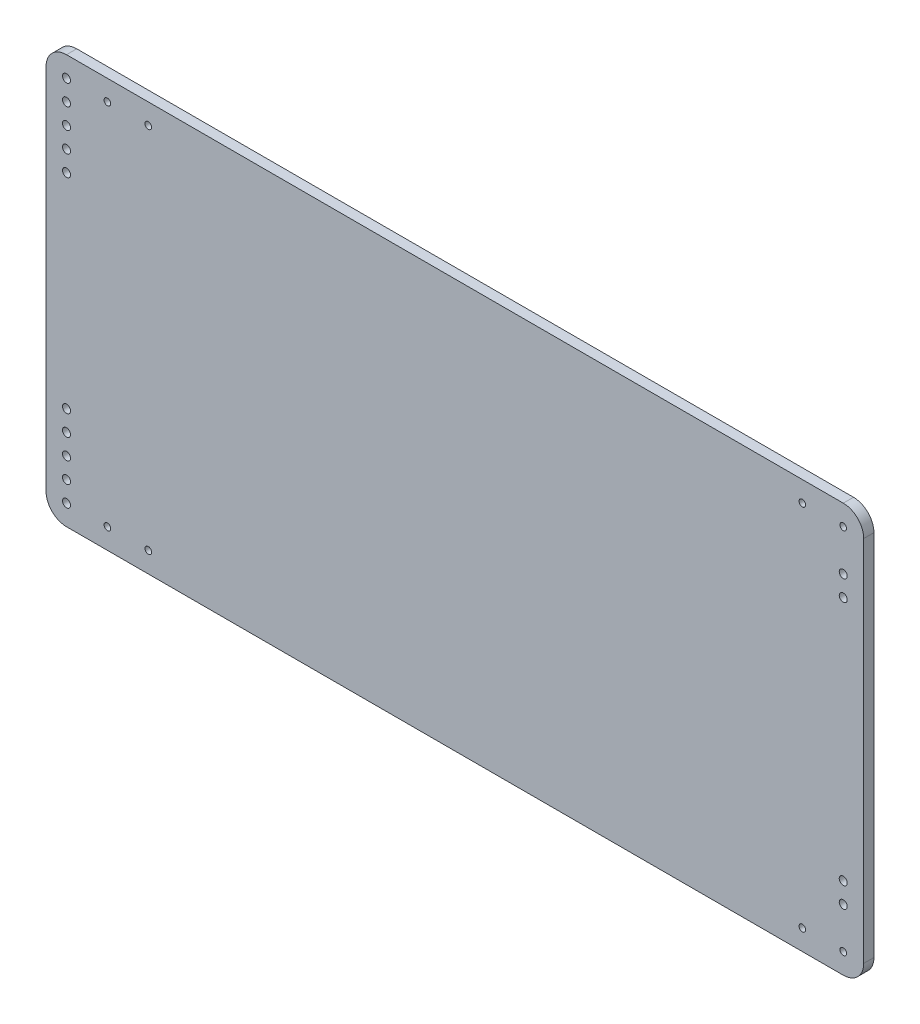
ISO-10303-21;
HEADER;
FILE_DESCRIPTION(('STEP AP214'),'2;1');
FILE_NAME('part.step','',(''),(''),'','','');
FILE_SCHEMA(('AUTOMOTIVE_DESIGN { 1 0 10303 214 1 1 1 1 }'));
ENDSEC;
DATA;
#1=APPLICATION_CONTEXT('core data for automotive mechanical design processes');
#2=APPLICATION_PROTOCOL_DEFINITION('international standard','automotive_design',2000,#1);
#3=PRODUCT_CONTEXT('',#1,'mechanical');
#4=PRODUCT('Part','Part','',(#3));
#5=PRODUCT_RELATED_PRODUCT_CATEGORY('part','',(#4));
#6=PRODUCT_DEFINITION_FORMATION('','',#4);
#7=PRODUCT_DEFINITION_CONTEXT('part definition',#1,'design');
#8=PRODUCT_DEFINITION('design','',#6,#7);
#9=PRODUCT_DEFINITION_SHAPE('','',#8);
#10=(LENGTH_UNIT() NAMED_UNIT(*) SI_UNIT(.MILLI.,.METRE.));
#11=(NAMED_UNIT(*) PLANE_ANGLE_UNIT() SI_UNIT($,.RADIAN.));
#12=(NAMED_UNIT(*) SI_UNIT($,.STERADIAN.) SOLID_ANGLE_UNIT());
#13=UNCERTAINTY_MEASURE_WITH_UNIT(LENGTH_MEASURE(1.E-05),#10,'distance_accuracy_value','');
#14=(GEOMETRIC_REPRESENTATION_CONTEXT(3) GLOBAL_UNCERTAINTY_ASSIGNED_CONTEXT((#13)) GLOBAL_UNIT_ASSIGNED_CONTEXT((#10,
#11,#12)) REPRESENTATION_CONTEXT('',''));
#15=CARTESIAN_POINT('',(0.,0.,0.));
#16=DIRECTION('',(0.,0.,1.));
#17=DIRECTION('',(1.,0.,0.));
#18=AXIS2_PLACEMENT_3D('',#15,#16,#17);
#19=CARTESIAN_POINT('',(495.3,241.3,6.35));
#20=DIRECTION('',(0.,0.,-1.));
#21=DIRECTION('',(-1.,0.,0.));
#22=AXIS2_PLACEMENT_3D('',#19,#20,#21);
#23=CYLINDRICAL_SURFACE('',#22,12.7);
#24=CARTESIAN_POINT('',(495.3,241.3,0.));
#25=DIRECTION('',(0.,0.,1.));
#26=DIRECTION('',(-1.,0.,0.));
#27=AXIS2_PLACEMENT_3D('',#24,#25,#26);
#28=CIRCLE('',#27,12.7);
#29=CARTESIAN_POINT('',(508.,241.3,0.));
#30=VERTEX_POINT('',#29);
#31=CARTESIAN_POINT('',(495.3,254.,0.));
#32=VERTEX_POINT('',#31);
#33=EDGE_CURVE('E139',#30,#32,#28,.T.);
#34=ORIENTED_EDGE('',*,*,#33,.T.);
#35=DIRECTION('',(0.,0.,-1.));
#36=VECTOR('',#35,1.);
#37=CARTESIAN_POINT('',(495.3,254.,6.35));
#38=LINE('',#37,#36);
#39=CARTESIAN_POINT('',(495.3,254.,6.35));
#40=VERTEX_POINT('',#39);
#41=EDGE_CURVE('E11',#40,#32,#38,.T.);
#42=ORIENTED_EDGE('',*,*,#41,.F.);
#43=CARTESIAN_POINT('',(495.3,241.3,6.35));
#44=DIRECTION('',(0.,0.,1.));
#45=DIRECTION('',(-1.,0.,0.));
#46=AXIS2_PLACEMENT_3D('',#43,#44,#45);
#47=CIRCLE('',#46,12.7);
#48=CARTESIAN_POINT('',(508.,241.3,6.35));
#49=VERTEX_POINT('',#48);
#50=EDGE_CURVE('E162',#49,#40,#47,.T.);
#51=ORIENTED_EDGE('',*,*,#50,.F.);
#52=DIRECTION('',(0.,0.,-1.));
#53=VECTOR('',#52,1.);
#54=CARTESIAN_POINT('',(508.,241.3,6.35));
#55=LINE('',#54,#53);
#56=EDGE_CURVE('E135',#49,#30,#55,.T.);
#57=ORIENTED_EDGE('',*,*,#56,.T.);
#58=EDGE_LOOP('',(#34,#42,#51,#57));
#59=FACE_BOUND('',#58,.T.);
#60=ADVANCED_FACE('F38',(#59),#23,.T.);
#61=CARTESIAN_POINT('',(12.7000000000001,254.,6.35));
#62=DIRECTION('',(0.,-1.,0.));
#63=DIRECTION('',(0.,0.,-1.));
#64=AXIS2_PLACEMENT_3D('',#61,#62,#63);
#65=PLANE('',#64);
#66=DIRECTION('',(-1.,0.,0.));
#67=VECTOR('',#66,1.);
#68=CARTESIAN_POINT('',(12.7000000000001,254.,0.));
#69=LINE('',#68,#67);
#70=CARTESIAN_POINT('',(12.7000000000001,254.,0.));
#71=VERTEX_POINT('',#70);
#72=EDGE_CURVE('E143',#32,#71,#69,.T.);
#73=ORIENTED_EDGE('',*,*,#72,.T.);
#74=DIRECTION('',(0.,0.,-1.));
#75=VECTOR('',#74,1.);
#76=CARTESIAN_POINT('',(12.7000000000001,254.,6.35));
#77=LINE('',#76,#75);
#78=CARTESIAN_POINT('',(12.7000000000001,254.,6.35));
#79=VERTEX_POINT('',#78);
#80=EDGE_CURVE('E47',#79,#71,#77,.T.);
#81=ORIENTED_EDGE('',*,*,#80,.F.);
#82=DIRECTION('',(-1.,0.,0.));
#83=VECTOR('',#82,1.);
#84=CARTESIAN_POINT('',(12.7000000000001,254.,6.35));
#85=LINE('',#84,#83);
#86=EDGE_CURVE('E98',#40,#79,#85,.T.);
#87=ORIENTED_EDGE('',*,*,#86,.F.);
#88=ORIENTED_EDGE('',*,*,#41,.T.);
#89=EDGE_LOOP('',(#73,#81,#87,#88));
#90=FACE_BOUND('',#89,.T.);
#91=ADVANCED_FACE('F449',(#90),#65,.F.);
#92=CARTESIAN_POINT('',(12.7,241.3,6.35));
#93=DIRECTION('',(0.,0.,-1.));
#94=DIRECTION('',(-1.,0.,0.));
#95=AXIS2_PLACEMENT_3D('',#92,#93,#94);
#96=CYLINDRICAL_SURFACE('',#95,12.7);
#97=CARTESIAN_POINT('',(12.7,241.3,0.));
#98=DIRECTION('',(0.,0.,1.));
#99=DIRECTION('',(-1.,0.,0.));
#100=AXIS2_PLACEMENT_3D('',#97,#98,#99);
#101=CIRCLE('',#100,12.7);
#102=CARTESIAN_POINT('',(0.,241.3,0.));
#103=VERTEX_POINT('',#102);
#104=EDGE_CURVE('E147',#71,#103,#101,.T.);
#105=ORIENTED_EDGE('',*,*,#104,.T.);
#106=DIRECTION('',(0.,0.,-1.));
#107=VECTOR('',#106,1.);
#108=CARTESIAN_POINT('',(0.,241.3,6.35));
#109=LINE('',#108,#107);
#110=CARTESIAN_POINT('',(0.,241.3,6.35));
#111=VERTEX_POINT('',#110);
#112=EDGE_CURVE('E173',#111,#103,#109,.T.);
#113=ORIENTED_EDGE('',*,*,#112,.F.);
#114=CARTESIAN_POINT('',(12.7,241.3,6.35));
#115=DIRECTION('',(0.,0.,1.));
#116=DIRECTION('',(-1.,0.,0.));
#117=AXIS2_PLACEMENT_3D('',#114,#115,#116);
#118=CIRCLE('',#117,12.7);
#119=EDGE_CURVE('E183',#79,#111,#118,.T.);
#120=ORIENTED_EDGE('',*,*,#119,.F.);
#121=ORIENTED_EDGE('',*,*,#80,.T.);
#122=EDGE_LOOP('',(#105,#113,#120,#121));
#123=FACE_BOUND('',#122,.T.);
#124=ADVANCED_FACE('F181',(#123),#96,.T.);
#125=CARTESIAN_POINT('',(0.,12.7000000000001,6.35));
#126=DIRECTION('',(1.,0.,0.));
#127=DIRECTION('',(0.,0.,-1.));
#128=AXIS2_PLACEMENT_3D('',#125,#126,#127);
#129=PLANE('',#128);
#130=DIRECTION('',(0.,-1.,0.));
#131=VECTOR('',#130,1.);
#132=CARTESIAN_POINT('',(0.,12.7000000000001,0.));
#133=LINE('',#132,#131);
#134=CARTESIAN_POINT('',(0.,12.7000000000001,0.));
#135=VERTEX_POINT('',#134);
#136=EDGE_CURVE('E150',#103,#135,#133,.T.);
#137=ORIENTED_EDGE('',*,*,#136,.T.);
#138=DIRECTION('',(0.,0.,-1.));
#139=VECTOR('',#138,1.);
#140=CARTESIAN_POINT('',(0.,12.7000000000001,6.35));
#141=LINE('',#140,#139);
#142=CARTESIAN_POINT('',(0.,12.7000000000001,6.35));
#143=VERTEX_POINT('',#142);
#144=EDGE_CURVE('E169',#143,#135,#141,.T.);
#145=ORIENTED_EDGE('',*,*,#144,.F.);
#146=DIRECTION('',(0.,-1.,0.));
#147=VECTOR('',#146,1.);
#148=CARTESIAN_POINT('',(0.,12.7000000000001,6.35));
#149=LINE('',#148,#147);
#150=EDGE_CURVE('E196',#111,#143,#149,.T.);
#151=ORIENTED_EDGE('',*,*,#150,.F.);
#152=ORIENTED_EDGE('',*,*,#112,.T.);
#153=EDGE_LOOP('',(#137,#145,#151,#152));
#154=FACE_BOUND('',#153,.T.);
#155=ADVANCED_FACE('F191',(#154),#129,.F.);
#156=CARTESIAN_POINT('',(12.7,12.7,6.35));
#157=DIRECTION('',(0.,0.,-1.));
#158=DIRECTION('',(-1.,0.,0.));
#159=AXIS2_PLACEMENT_3D('',#156,#157,#158);
#160=CYLINDRICAL_SURFACE('',#159,12.7);
#161=CARTESIAN_POINT('',(12.7,12.7,0.));
#162=DIRECTION('',(0.,0.,1.));
#163=DIRECTION('',(-1.,0.,0.));
#164=AXIS2_PLACEMENT_3D('',#161,#162,#163);
#165=CIRCLE('',#164,12.7);
#166=CARTESIAN_POINT('',(12.7000000000001,0.,0.));
#167=VERTEX_POINT('',#166);
#168=EDGE_CURVE('E153',#135,#167,#165,.T.);
#169=ORIENTED_EDGE('',*,*,#168,.T.);
#170=DIRECTION('',(0.,0.,-1.));
#171=VECTOR('',#170,1.);
#172=CARTESIAN_POINT('',(12.7000000000001,0.,6.35));
#173=LINE('',#172,#171);
#174=CARTESIAN_POINT('',(12.7000000000001,0.,6.35));
#175=VERTEX_POINT('',#174);
#176=EDGE_CURVE('E128',#175,#167,#173,.T.);
#177=ORIENTED_EDGE('',*,*,#176,.F.);
#178=CARTESIAN_POINT('',(12.7,12.7,6.35));
#179=DIRECTION('',(0.,0.,1.));
#180=DIRECTION('',(-1.,0.,0.));
#181=AXIS2_PLACEMENT_3D('',#178,#179,#180);
#182=CIRCLE('',#181,12.7);
#183=EDGE_CURVE('E117',#143,#175,#182,.T.);
#184=ORIENTED_EDGE('',*,*,#183,.F.);
#185=ORIENTED_EDGE('',*,*,#144,.T.);
#186=EDGE_LOOP('',(#169,#177,#184,#185));
#187=FACE_BOUND('',#186,.T.);
#188=ADVANCED_FACE('F194',(#187),#160,.T.);
#189=CARTESIAN_POINT('',(12.7000000000001,0.,6.35));
#190=DIRECTION('',(0.,1.,0.));
#191=DIRECTION('',(0.,0.,1.));
#192=AXIS2_PLACEMENT_3D('',#189,#190,#191);
#193=PLANE('',#192);
#194=DIRECTION('',(1.,0.,0.));
#195=VECTOR('',#194,1.);
#196=CARTESIAN_POINT('',(12.7000000000001,0.,0.));
#197=LINE('',#196,#195);
#198=CARTESIAN_POINT('',(495.3,0.,0.));
#199=VERTEX_POINT('',#198);
#200=EDGE_CURVE('E126',#167,#199,#197,.T.);
#201=ORIENTED_EDGE('',*,*,#200,.T.);
#202=DIRECTION('',(0.,0.,-1.));
#203=VECTOR('',#202,1.);
#204=CARTESIAN_POINT('',(495.3,0.,6.35));
#205=LINE('',#204,#203);
#206=CARTESIAN_POINT('',(495.3,0.,6.35));
#207=VERTEX_POINT('',#206);
#208=EDGE_CURVE('E123',#207,#199,#205,.T.);
#209=ORIENTED_EDGE('',*,*,#208,.F.);
#210=DIRECTION('',(1.,0.,0.));
#211=VECTOR('',#210,1.);
#212=CARTESIAN_POINT('',(12.7000000000001,0.,6.35));
#213=LINE('',#212,#211);
#214=EDGE_CURVE('E111',#175,#207,#213,.T.);
#215=ORIENTED_EDGE('',*,*,#214,.F.);
#216=ORIENTED_EDGE('',*,*,#176,.T.);
#217=EDGE_LOOP('',(#201,#209,#215,#216));
#218=FACE_BOUND('',#217,.T.);
#219=ADVANCED_FACE('F124',(#218),#193,.F.);
#220=CARTESIAN_POINT('',(495.3,12.7,6.35));
#221=DIRECTION('',(0.,0.,-1.));
#222=DIRECTION('',(-1.,0.,0.));
#223=AXIS2_PLACEMENT_3D('',#220,#221,#222);
#224=CYLINDRICAL_SURFACE('',#223,12.7);
#225=CARTESIAN_POINT('',(495.3,12.7,0.));
#226=DIRECTION('',(0.,0.,1.));
#227=DIRECTION('',(1.,0.,0.));
#228=AXIS2_PLACEMENT_3D('',#225,#226,#227);
#229=CIRCLE('',#228,12.7);
#230=CARTESIAN_POINT('',(508.,12.7,0.));
#231=VERTEX_POINT('',#230);
#232=EDGE_CURVE('E84',#199,#231,#229,.T.);
#233=ORIENTED_EDGE('',*,*,#232,.T.);
#234=DIRECTION('',(0.,0.,-1.));
#235=VECTOR('',#234,1.);
#236=CARTESIAN_POINT('',(508.,12.7,6.35));
#237=LINE('',#236,#235);
#238=CARTESIAN_POINT('',(508.,12.7,6.35));
#239=VERTEX_POINT('',#238);
#240=EDGE_CURVE('E129',#239,#231,#237,.T.);
#241=ORIENTED_EDGE('',*,*,#240,.F.);
#242=CARTESIAN_POINT('',(495.3,12.7,6.35));
#243=DIRECTION('',(0.,0.,1.));
#244=DIRECTION('',(1.,0.,0.));
#245=AXIS2_PLACEMENT_3D('',#242,#243,#244);
#246=CIRCLE('',#245,12.7);
#247=EDGE_CURVE('E115',#207,#239,#246,.T.);
#248=ORIENTED_EDGE('',*,*,#247,.F.);
#249=ORIENTED_EDGE('',*,*,#208,.T.);
#250=EDGE_LOOP('',(#233,#241,#248,#249));
#251=FACE_BOUND('',#250,.T.);
#252=ADVANCED_FACE('F131',(#251),#224,.T.);
#253=CARTESIAN_POINT('',(508.,12.7000000000001,6.35));
#254=DIRECTION('',(-1.,0.,0.));
#255=DIRECTION('',(0.,0.,1.));
#256=AXIS2_PLACEMENT_3D('',#253,#254,#255);
#257=PLANE('',#256);
#258=DIRECTION('',(0.,1.,0.));
#259=VECTOR('',#258,1.);
#260=CARTESIAN_POINT('',(508.,12.7000000000001,0.));
#261=LINE('',#260,#259);
#262=EDGE_CURVE('E90',#231,#30,#261,.T.);
#263=ORIENTED_EDGE('',*,*,#262,.T.);
#264=ORIENTED_EDGE('',*,*,#56,.F.);
#265=DIRECTION('',(0.,1.,0.));
#266=VECTOR('',#265,1.);
#267=CARTESIAN_POINT('',(508.,12.7000000000001,6.35));
#268=LINE('',#267,#266);
#269=EDGE_CURVE('E55',#239,#49,#268,.T.);
#270=ORIENTED_EDGE('',*,*,#269,.F.);
#271=ORIENTED_EDGE('',*,*,#240,.T.);
#272=EDGE_LOOP('',(#263,#264,#270,#271));
#273=FACE_BOUND('',#272,.T.);
#274=ADVANCED_FACE('F394',(#273),#257,.F.);
#275=CARTESIAN_POINT('',(495.3,241.3,6.35));
#276=DIRECTION('',(0.,0.,-1.));
#277=DIRECTION('',(-1.,0.,0.));
#278=AXIS2_PLACEMENT_3D('',#275,#276,#277);
#279=PLANE('',#278);
#280=CARTESIAN_POINT('',(495.279454624038,241.3,6.35));
#281=DIRECTION('',(0.,0.,1.));
#282=DIRECTION('',(1.,0.,0.));
#283=AXIS2_PLACEMENT_3D('',#280,#281,#282);
#284=CIRCLE('',#283,2.07010000000004);
#285=CARTESIAN_POINT('',(497.349554624038,241.3,6.35));
#286=VERTEX_POINT('',#285);
#287=EDGE_CURVE('E351',#286,#286,#284,.T.);
#288=ORIENTED_EDGE('',*,*,#287,.F.);
#289=EDGE_LOOP('',(#288));
#290=FACE_BOUND('',#289,.T.);
#291=CARTESIAN_POINT('',(495.279454624038,215.9,6.35));
#292=DIRECTION('',(0.,0.,1.));
#293=DIRECTION('',(1.,0.,0.));
#294=AXIS2_PLACEMENT_3D('',#291,#292,#293);
#295=CIRCLE('',#294,2.48920000000001);
#296=CARTESIAN_POINT('',(497.768654624038,215.9,6.35));
#297=VERTEX_POINT('',#296);
#298=EDGE_CURVE('E343',#297,#297,#295,.T.);
#299=ORIENTED_EDGE('',*,*,#298,.F.);
#300=EDGE_LOOP('',(#299));
#301=FACE_BOUND('',#300,.T.);
#302=CARTESIAN_POINT('',(495.279454624038,203.2,6.35));
#303=DIRECTION('',(0.,0.,1.));
#304=DIRECTION('',(1.,0.,0.));
#305=AXIS2_PLACEMENT_3D('',#302,#303,#304);
#306=CIRCLE('',#305,2.48919999999995);
#307=CARTESIAN_POINT('',(497.768654624038,203.2,6.35));
#308=VERTEX_POINT('',#307);
#309=EDGE_CURVE('E335',#308,#308,#306,.T.);
#310=ORIENTED_EDGE('',*,*,#309,.F.);
#311=EDGE_LOOP('',(#310));
#312=FACE_BOUND('',#311,.T.);
#313=CARTESIAN_POINT('',(469.879454624038,12.7,6.35));
#314=DIRECTION('',(0.,0.,1.));
#315=DIRECTION('',(-1.,0.,0.));
#316=AXIS2_PLACEMENT_3D('',#313,#314,#315);
#317=CIRCLE('',#316,2.07010000000016);
#318=CARTESIAN_POINT('',(467.809354624037,12.7,6.35));
#319=VERTEX_POINT('',#318);
#320=EDGE_CURVE('E326',#319,#319,#317,.T.);
#321=ORIENTED_EDGE('',*,*,#320,.F.);
#322=EDGE_LOOP('',(#321));
#323=FACE_BOUND('',#322,.T.);
#324=CARTESIAN_POINT('',(495.279454624038,12.7,6.35));
#325=DIRECTION('',(0.,0.,1.));
#326=DIRECTION('',(-1.,0.,0.));
#327=AXIS2_PLACEMENT_3D('',#324,#325,#326);
#328=CIRCLE('',#327,2.07010000000004);
#329=CARTESIAN_POINT('',(493.209354624038,12.7,6.35));
#330=VERTEX_POINT('',#329);
#331=EDGE_CURVE('E374',#330,#330,#328,.T.);
#332=ORIENTED_EDGE('',*,*,#331,.F.);
#333=EDGE_LOOP('',(#332));
#334=FACE_BOUND('',#333,.T.);
#335=CARTESIAN_POINT('',(495.279454624038,38.1000000000002,6.35));
#336=DIRECTION('',(0.,0.,1.));
#337=DIRECTION('',(-1.,0.,0.));
#338=AXIS2_PLACEMENT_3D('',#335,#336,#337);
#339=CIRCLE('',#338,2.48920000000001);
#340=CARTESIAN_POINT('',(492.790254624038,38.1000000000002,6.35));
#341=VERTEX_POINT('',#340);
#342=EDGE_CURVE('E366',#341,#341,#339,.T.);
#343=ORIENTED_EDGE('',*,*,#342,.F.);
#344=EDGE_LOOP('',(#343));
#345=FACE_BOUND('',#344,.T.);
#346=CARTESIAN_POINT('',(495.279454624038,50.8000000000002,6.35));
#347=DIRECTION('',(0.,0.,1.));
#348=DIRECTION('',(-1.,0.,0.));
#349=AXIS2_PLACEMENT_3D('',#346,#347,#348);
#350=CIRCLE('',#349,2.48919999999995);
#351=CARTESIAN_POINT('',(492.790254624038,50.8000000000002,6.35));
#352=VERTEX_POINT('',#351);
#353=EDGE_CURVE('E358',#352,#352,#350,.T.);
#354=ORIENTED_EDGE('',*,*,#353,.F.);
#355=EDGE_LOOP('',(#354));
#356=FACE_BOUND('',#355,.T.);
#357=CARTESIAN_POINT('',(469.879454624038,241.3,6.35));
#358=DIRECTION('',(0.,0.,1.));
#359=DIRECTION('',(1.,0.,0.));
#360=AXIS2_PLACEMENT_3D('',#357,#358,#359);
#361=CIRCLE('',#360,2.07010000000016);
#362=CARTESIAN_POINT('',(471.949554624038,241.3,6.35));
#363=VERTEX_POINT('',#362);
#364=EDGE_CURVE('E318',#363,#363,#361,.T.);
#365=ORIENTED_EDGE('',*,*,#364,.F.);
#366=EDGE_LOOP('',(#365));
#367=FACE_BOUND('',#366,.T.);
#368=CARTESIAN_POINT('',(38.1000000000002,12.6999999999999,6.35));
#369=DIRECTION('',(0.,0.,1.));
#370=DIRECTION('',(-1.,0.,0.));
#371=AXIS2_PLACEMENT_3D('',#368,#369,#370);
#372=CIRCLE('',#371,2.07009999999998);
#373=CARTESIAN_POINT('',(36.0299000000002,12.6999999999999,6.35));
#374=VERTEX_POINT('',#373);
#375=EDGE_CURVE('E271',#374,#374,#372,.T.);
#376=ORIENTED_EDGE('',*,*,#375,.F.);
#377=EDGE_LOOP('',(#376));
#378=FACE_BOUND('',#377,.T.);
#379=CARTESIAN_POINT('',(12.7000000000003,190.5,6.35));
#380=DIRECTION('',(0.,0.,1.));
#381=DIRECTION('',(1.,0.,0.));
#382=AXIS2_PLACEMENT_3D('',#379,#380,#381);
#383=CIRCLE('',#382,2.49999999999967);
#384=CARTESIAN_POINT('',(15.2,190.5,6.35));
#385=VERTEX_POINT('',#384);
#386=EDGE_CURVE('E263',#385,#385,#383,.T.);
#387=ORIENTED_EDGE('',*,*,#386,.F.);
#388=EDGE_LOOP('',(#387));
#389=FACE_BOUND('',#388,.T.);
#390=CARTESIAN_POINT('',(12.7000000000003,203.2,6.35));
#391=DIRECTION('',(0.,0.,1.));
#392=DIRECTION('',(1.,0.,0.));
#393=AXIS2_PLACEMENT_3D('',#390,#391,#392);
#394=CIRCLE('',#393,2.4999999999998);
#395=CARTESIAN_POINT('',(15.2000000000001,203.2,6.35));
#396=VERTEX_POINT('',#395);
#397=EDGE_CURVE('E255',#396,#396,#394,.T.);
#398=ORIENTED_EDGE('',*,*,#397,.F.);
#399=EDGE_LOOP('',(#398));
#400=FACE_BOUND('',#399,.T.);
#401=CARTESIAN_POINT('',(12.7000000000003,215.9,6.35));
#402=DIRECTION('',(0.,0.,1.));
#403=DIRECTION('',(1.,0.,0.));
#404=AXIS2_PLACEMENT_3D('',#401,#402,#403);
#405=CIRCLE('',#404,2.4999999999998);
#406=CARTESIAN_POINT('',(15.2000000000001,215.9,6.35));
#407=VERTEX_POINT('',#406);
#408=EDGE_CURVE('E247',#407,#407,#405,.T.);
#409=ORIENTED_EDGE('',*,*,#408,.F.);
#410=EDGE_LOOP('',(#409));
#411=FACE_BOUND('',#410,.T.);
#412=CARTESIAN_POINT('',(12.7000000000003,228.6,6.35));
#413=DIRECTION('',(0.,0.,1.));
#414=DIRECTION('',(1.,0.,0.));
#415=AXIS2_PLACEMENT_3D('',#412,#413,#414);
#416=CIRCLE('',#415,2.49999999999967);
#417=CARTESIAN_POINT('',(15.2,228.6,6.35));
#418=VERTEX_POINT('',#417);
#419=EDGE_CURVE('E239',#418,#418,#416,.T.);
#420=ORIENTED_EDGE('',*,*,#419,.F.);
#421=EDGE_LOOP('',(#420));
#422=FACE_BOUND('',#421,.T.);
#423=CARTESIAN_POINT('',(12.7000000000003,241.3,6.35));
#424=DIRECTION('',(0.,0.,1.));
#425=DIRECTION('',(1.,0.,0.));
#426=AXIS2_PLACEMENT_3D('',#423,#424,#425);
#427=CIRCLE('',#426,2.48919999999983);
#428=CARTESIAN_POINT('',(15.1892000000002,241.3,6.35));
#429=VERTEX_POINT('',#428);
#430=EDGE_CURVE('E231',#429,#429,#427,.T.);
#431=ORIENTED_EDGE('',*,*,#430,.F.);
#432=EDGE_LOOP('',(#431));
#433=FACE_BOUND('',#432,.T.);
#434=CARTESIAN_POINT('',(38.1000000000002,241.3,6.35));
#435=DIRECTION('',(0.,0.,1.));
#436=DIRECTION('',(1.,0.,0.));
#437=AXIS2_PLACEMENT_3D('',#434,#435,#436);
#438=CIRCLE('',#437,2.07009999999998);
#439=CARTESIAN_POINT('',(40.1701000000002,241.3,6.35));
#440=VERTEX_POINT('',#439);
#441=EDGE_CURVE('E223',#440,#440,#438,.T.);
#442=ORIENTED_EDGE('',*,*,#441,.F.);
#443=EDGE_LOOP('',(#442));
#444=FACE_BOUND('',#443,.T.);
#445=CARTESIAN_POINT('',(63.5000000000002,241.3,6.35));
#446=DIRECTION('',(0.,0.,1.));
#447=DIRECTION('',(1.,0.,0.));
#448=AXIS2_PLACEMENT_3D('',#445,#446,#447);
#449=CIRCLE('',#448,2.07009999999998);
#450=CARTESIAN_POINT('',(65.5701000000002,241.3,6.35));
#451=VERTEX_POINT('',#450);
#452=EDGE_CURVE('E214',#451,#451,#449,.T.);
#453=ORIENTED_EDGE('',*,*,#452,.F.);
#454=EDGE_LOOP('',(#453));
#455=FACE_BOUND('',#454,.T.);
#456=CARTESIAN_POINT('',(12.7000000000003,63.5000000000001,6.35));
#457=DIRECTION('',(0.,0.,1.));
#458=DIRECTION('',(-1.,0.,0.));
#459=AXIS2_PLACEMENT_3D('',#456,#457,#458);
#460=CIRCLE('',#459,2.49999999999967);
#461=CARTESIAN_POINT('',(10.2000000000006,63.5000000000001,6.35));
#462=VERTEX_POINT('',#461);
#463=EDGE_CURVE('E311',#462,#462,#460,.T.);
#464=ORIENTED_EDGE('',*,*,#463,.F.);
#465=EDGE_LOOP('',(#464));
#466=FACE_BOUND('',#465,.T.);
#467=CARTESIAN_POINT('',(12.7000000000003,50.7999999999999,6.35));
#468=DIRECTION('',(0.,0.,1.));
#469=DIRECTION('',(-1.,0.,0.));
#470=AXIS2_PLACEMENT_3D('',#467,#468,#469);
#471=CIRCLE('',#470,2.4999999999998);
#472=CARTESIAN_POINT('',(10.2000000000005,50.7999999999999,6.35));
#473=VERTEX_POINT('',#472);
#474=EDGE_CURVE('E303',#473,#473,#471,.T.);
#475=ORIENTED_EDGE('',*,*,#474,.F.);
#476=EDGE_LOOP('',(#475));
#477=FACE_BOUND('',#476,.T.);
#478=CARTESIAN_POINT('',(12.7000000000003,38.1,6.35));
#479=DIRECTION('',(0.,0.,1.));
#480=DIRECTION('',(-1.,0.,0.));
#481=AXIS2_PLACEMENT_3D('',#478,#479,#480);
#482=CIRCLE('',#481,2.4999999999998);
#483=CARTESIAN_POINT('',(10.2000000000005,38.1,6.35));
#484=VERTEX_POINT('',#483);
#485=EDGE_CURVE('E295',#484,#484,#482,.T.);
#486=ORIENTED_EDGE('',*,*,#485,.F.);
#487=EDGE_LOOP('',(#486));
#488=FACE_BOUND('',#487,.T.);
#489=CARTESIAN_POINT('',(12.7000000000003,25.4000000000001,6.35));
#490=DIRECTION('',(0.,0.,1.));
#491=DIRECTION('',(-1.,0.,0.));
#492=AXIS2_PLACEMENT_3D('',#489,#490,#491);
#493=CIRCLE('',#492,2.49999999999967);
#494=CARTESIAN_POINT('',(10.2000000000006,25.4000000000001,6.35));
#495=VERTEX_POINT('',#494);
#496=EDGE_CURVE('E287',#495,#495,#493,.T.);
#497=ORIENTED_EDGE('',*,*,#496,.F.);
#498=EDGE_LOOP('',(#497));
#499=FACE_BOUND('',#498,.T.);
#500=CARTESIAN_POINT('',(12.7000000000003,12.6999999999999,6.35));
#501=DIRECTION('',(0.,0.,1.));
#502=DIRECTION('',(-1.,0.,0.));
#503=AXIS2_PLACEMENT_3D('',#500,#501,#502);
#504=CIRCLE('',#503,2.48919999999983);
#505=CARTESIAN_POINT('',(10.2108000000005,12.6999999999999,6.35));
#506=VERTEX_POINT('',#505);
#507=EDGE_CURVE('E278',#506,#506,#504,.T.);
#508=ORIENTED_EDGE('',*,*,#507,.F.);
#509=EDGE_LOOP('',(#508));
#510=FACE_BOUND('',#509,.T.);
#511=CARTESIAN_POINT('',(63.5000000000002,12.6999999999999,6.35));
#512=DIRECTION('',(0.,0.,1.));
#513=DIRECTION('',(-1.,0.,0.));
#514=AXIS2_PLACEMENT_3D('',#511,#512,#513);
#515=CIRCLE('',#514,2.07009999999998);
#516=CARTESIAN_POINT('',(61.4299000000002,12.6999999999999,6.35));
#517=VERTEX_POINT('',#516);
#518=EDGE_CURVE('E206',#517,#517,#515,.T.);
#519=ORIENTED_EDGE('',*,*,#518,.F.);
#520=EDGE_LOOP('',(#519));
#521=FACE_BOUND('',#520,.T.);
#522=ORIENTED_EDGE('',*,*,#50,.T.);
#523=ORIENTED_EDGE('',*,*,#86,.T.);
#524=ORIENTED_EDGE('',*,*,#119,.T.);
#525=ORIENTED_EDGE('',*,*,#150,.T.);
#526=ORIENTED_EDGE('',*,*,#183,.T.);
#527=ORIENTED_EDGE('',*,*,#214,.T.);
#528=ORIENTED_EDGE('',*,*,#247,.T.);
#529=ORIENTED_EDGE('',*,*,#269,.T.);
#530=EDGE_LOOP('',(#522,#523,#524,#525,#526,#527,#528,#529));
#531=FACE_BOUND('',#530,.T.);
#532=ADVANCED_FACE('F113',(#290,#301,#312,#323,#334,#345,#356,#367,#378,#389,#400,#411,#422,
#433,#444,#455,#466,#477,#488,#499,#510,#521,#531),#279,.F.);
#533=CARTESIAN_POINT('',(495.3,241.3,0.));
#534=DIRECTION('',(0.,0.,-1.));
#535=DIRECTION('',(-1.,0.,0.));
#536=AXIS2_PLACEMENT_3D('',#533,#534,#535);
#537=PLANE('',#536);
#538=CARTESIAN_POINT('',(495.279454624038,241.3,0.));
#539=DIRECTION('',(0.,0.,1.));
#540=DIRECTION('',(1.,0.,0.));
#541=AXIS2_PLACEMENT_3D('',#538,#539,#540);
#542=CIRCLE('',#541,2.07010000000004);
#543=CARTESIAN_POINT('',(497.349554624038,241.3,0.));
#544=VERTEX_POINT('',#543);
#545=EDGE_CURVE('E322',#544,#544,#542,.T.);
#546=ORIENTED_EDGE('',*,*,#545,.T.);
#547=EDGE_LOOP('',(#546));
#548=FACE_BOUND('',#547,.T.);
#549=CARTESIAN_POINT('',(495.279454624038,215.9,0.));
#550=DIRECTION('',(0.,0.,1.));
#551=DIRECTION('',(1.,0.,0.));
#552=AXIS2_PLACEMENT_3D('',#549,#550,#551);
#553=CIRCLE('',#552,2.48920000000001);
#554=CARTESIAN_POINT('',(497.768654624038,215.9,0.));
#555=VERTEX_POINT('',#554);
#556=EDGE_CURVE('E347',#555,#555,#553,.T.);
#557=ORIENTED_EDGE('',*,*,#556,.T.);
#558=EDGE_LOOP('',(#557));
#559=FACE_BOUND('',#558,.T.);
#560=CARTESIAN_POINT('',(495.279454624038,203.2,0.));
#561=DIRECTION('',(0.,0.,1.));
#562=DIRECTION('',(1.,0.,0.));
#563=AXIS2_PLACEMENT_3D('',#560,#561,#562);
#564=CIRCLE('',#563,2.48919999999995);
#565=CARTESIAN_POINT('',(497.768654624038,203.2,0.));
#566=VERTEX_POINT('',#565);
#567=EDGE_CURVE('E339',#566,#566,#564,.T.);
#568=ORIENTED_EDGE('',*,*,#567,.T.);
#569=EDGE_LOOP('',(#568));
#570=FACE_BOUND('',#569,.T.);
#571=CARTESIAN_POINT('',(469.879454624038,12.7,0.));
#572=DIRECTION('',(0.,0.,1.));
#573=DIRECTION('',(-1.,0.,0.));
#574=AXIS2_PLACEMENT_3D('',#571,#572,#573);
#575=CIRCLE('',#574,2.07010000000016);
#576=CARTESIAN_POINT('',(467.809354624037,12.7,0.));
#577=VERTEX_POINT('',#576);
#578=EDGE_CURVE('E330',#577,#577,#575,.T.);
#579=ORIENTED_EDGE('',*,*,#578,.T.);
#580=EDGE_LOOP('',(#579));
#581=FACE_BOUND('',#580,.T.);
#582=CARTESIAN_POINT('',(495.279454624038,12.7,0.));
#583=DIRECTION('',(0.,0.,1.));
#584=DIRECTION('',(-1.,0.,0.));
#585=AXIS2_PLACEMENT_3D('',#582,#583,#584);
#586=CIRCLE('',#585,2.07010000000004);
#587=CARTESIAN_POINT('',(493.209354624038,12.7,0.));
#588=VERTEX_POINT('',#587);
#589=EDGE_CURVE('E331',#588,#588,#586,.T.);
#590=ORIENTED_EDGE('',*,*,#589,.T.);
#591=EDGE_LOOP('',(#590));
#592=FACE_BOUND('',#591,.T.);
#593=CARTESIAN_POINT('',(495.279454624038,38.1000000000002,0.));
#594=DIRECTION('',(0.,0.,1.));
#595=DIRECTION('',(-1.,0.,0.));
#596=AXIS2_PLACEMENT_3D('',#593,#594,#595);
#597=CIRCLE('',#596,2.48920000000001);
#598=CARTESIAN_POINT('',(492.790254624038,38.1000000000002,0.));
#599=VERTEX_POINT('',#598);
#600=EDGE_CURVE('E370',#599,#599,#597,.T.);
#601=ORIENTED_EDGE('',*,*,#600,.T.);
#602=EDGE_LOOP('',(#601));
#603=FACE_BOUND('',#602,.T.);
#604=CARTESIAN_POINT('',(495.279454624038,50.8000000000002,0.));
#605=DIRECTION('',(0.,0.,1.));
#606=DIRECTION('',(-1.,0.,0.));
#607=AXIS2_PLACEMENT_3D('',#604,#605,#606);
#608=CIRCLE('',#607,2.48919999999995);
#609=CARTESIAN_POINT('',(492.790254624038,50.8000000000002,0.));
#610=VERTEX_POINT('',#609);
#611=EDGE_CURVE('E362',#610,#610,#608,.T.);
#612=ORIENTED_EDGE('',*,*,#611,.T.);
#613=EDGE_LOOP('',(#612));
#614=FACE_BOUND('',#613,.T.);
#615=CARTESIAN_POINT('',(469.879454624038,241.3,0.));
#616=DIRECTION('',(0.,0.,1.));
#617=DIRECTION('',(1.,0.,0.));
#618=AXIS2_PLACEMENT_3D('',#615,#616,#617);
#619=CIRCLE('',#618,2.07010000000016);
#620=CARTESIAN_POINT('',(471.949554624038,241.3,0.));
#621=VERTEX_POINT('',#620);
#622=EDGE_CURVE('E283',#621,#621,#619,.T.);
#623=ORIENTED_EDGE('',*,*,#622,.T.);
#624=EDGE_LOOP('',(#623));
#625=FACE_BOUND('',#624,.T.);
#626=CARTESIAN_POINT('',(38.1000000000002,12.6999999999999,0.));
#627=DIRECTION('',(0.,0.,1.));
#628=DIRECTION('',(-1.,0.,0.));
#629=AXIS2_PLACEMENT_3D('',#626,#627,#628);
#630=CIRCLE('',#629,2.07009999999998);
#631=CARTESIAN_POINT('',(36.0299000000002,12.6999999999999,0.));
#632=VERTEX_POINT('',#631);
#633=EDGE_CURVE('E210',#632,#632,#630,.T.);
#634=ORIENTED_EDGE('',*,*,#633,.T.);
#635=EDGE_LOOP('',(#634));
#636=FACE_BOUND('',#635,.T.);
#637=CARTESIAN_POINT('',(12.7000000000003,190.5,0.));
#638=DIRECTION('',(0.,0.,1.));
#639=DIRECTION('',(1.,0.,0.));
#640=AXIS2_PLACEMENT_3D('',#637,#638,#639);
#641=CIRCLE('',#640,2.49999999999967);
#642=CARTESIAN_POINT('',(15.2,190.5,0.));
#643=VERTEX_POINT('',#642);
#644=EDGE_CURVE('E267',#643,#643,#641,.T.);
#645=ORIENTED_EDGE('',*,*,#644,.T.);
#646=EDGE_LOOP('',(#645));
#647=FACE_BOUND('',#646,.T.);
#648=CARTESIAN_POINT('',(12.7000000000003,203.2,0.));
#649=DIRECTION('',(0.,0.,1.));
#650=DIRECTION('',(1.,0.,0.));
#651=AXIS2_PLACEMENT_3D('',#648,#649,#650);
#652=CIRCLE('',#651,2.4999999999998);
#653=CARTESIAN_POINT('',(15.2000000000001,203.2,0.));
#654=VERTEX_POINT('',#653);
#655=EDGE_CURVE('E259',#654,#654,#652,.T.);
#656=ORIENTED_EDGE('',*,*,#655,.T.);
#657=EDGE_LOOP('',(#656));
#658=FACE_BOUND('',#657,.T.);
#659=CARTESIAN_POINT('',(12.7000000000003,215.9,0.));
#660=DIRECTION('',(0.,0.,1.));
#661=DIRECTION('',(1.,0.,0.));
#662=AXIS2_PLACEMENT_3D('',#659,#660,#661);
#663=CIRCLE('',#662,2.4999999999998);
#664=CARTESIAN_POINT('',(15.2000000000001,215.9,0.));
#665=VERTEX_POINT('',#664);
#666=EDGE_CURVE('E251',#665,#665,#663,.T.);
#667=ORIENTED_EDGE('',*,*,#666,.T.);
#668=EDGE_LOOP('',(#667));
#669=FACE_BOUND('',#668,.T.);
#670=CARTESIAN_POINT('',(12.7000000000003,228.6,0.));
#671=DIRECTION('',(0.,0.,1.));
#672=DIRECTION('',(1.,0.,0.));
#673=AXIS2_PLACEMENT_3D('',#670,#671,#672);
#674=CIRCLE('',#673,2.49999999999967);
#675=CARTESIAN_POINT('',(15.2,228.6,0.));
#676=VERTEX_POINT('',#675);
#677=EDGE_CURVE('E243',#676,#676,#674,.T.);
#678=ORIENTED_EDGE('',*,*,#677,.T.);
#679=EDGE_LOOP('',(#678));
#680=FACE_BOUND('',#679,.T.);
#681=CARTESIAN_POINT('',(12.7000000000003,241.3,0.));
#682=DIRECTION('',(0.,0.,1.));
#683=DIRECTION('',(1.,0.,0.));
#684=AXIS2_PLACEMENT_3D('',#681,#682,#683);
#685=CIRCLE('',#684,2.48919999999983);
#686=CARTESIAN_POINT('',(15.1892000000002,241.3,0.));
#687=VERTEX_POINT('',#686);
#688=EDGE_CURVE('E235',#687,#687,#685,.T.);
#689=ORIENTED_EDGE('',*,*,#688,.T.);
#690=EDGE_LOOP('',(#689));
#691=FACE_BOUND('',#690,.T.);
#692=CARTESIAN_POINT('',(38.1000000000002,241.3,0.));
#693=DIRECTION('',(0.,0.,1.));
#694=DIRECTION('',(1.,0.,0.));
#695=AXIS2_PLACEMENT_3D('',#692,#693,#694);
#696=CIRCLE('',#695,2.07009999999998);
#697=CARTESIAN_POINT('',(40.1701000000002,241.3,0.));
#698=VERTEX_POINT('',#697);
#699=EDGE_CURVE('E227',#698,#698,#696,.T.);
#700=ORIENTED_EDGE('',*,*,#699,.T.);
#701=EDGE_LOOP('',(#700));
#702=FACE_BOUND('',#701,.T.);
#703=CARTESIAN_POINT('',(63.5000000000002,241.3,0.));
#704=DIRECTION('',(0.,0.,1.));
#705=DIRECTION('',(1.,0.,0.));
#706=AXIS2_PLACEMENT_3D('',#703,#704,#705);
#707=CIRCLE('',#706,2.07009999999998);
#708=CARTESIAN_POINT('',(65.5701000000002,241.3,0.));
#709=VERTEX_POINT('',#708);
#710=EDGE_CURVE('E218',#709,#709,#707,.T.);
#711=ORIENTED_EDGE('',*,*,#710,.T.);
#712=EDGE_LOOP('',(#711));
#713=FACE_BOUND('',#712,.T.);
#714=CARTESIAN_POINT('',(12.7000000000003,63.5000000000001,0.));
#715=DIRECTION('',(0.,0.,1.));
#716=DIRECTION('',(-1.,0.,0.));
#717=AXIS2_PLACEMENT_3D('',#714,#715,#716);
#718=CIRCLE('',#717,2.49999999999967);
#719=CARTESIAN_POINT('',(10.2000000000006,63.5000000000001,0.));
#720=VERTEX_POINT('',#719);
#721=EDGE_CURVE('E219',#720,#720,#718,.T.);
#722=ORIENTED_EDGE('',*,*,#721,.T.);
#723=EDGE_LOOP('',(#722));
#724=FACE_BOUND('',#723,.T.);
#725=CARTESIAN_POINT('',(12.7000000000003,50.7999999999999,0.));
#726=DIRECTION('',(0.,0.,1.));
#727=DIRECTION('',(-1.,0.,0.));
#728=AXIS2_PLACEMENT_3D('',#725,#726,#727);
#729=CIRCLE('',#728,2.4999999999998);
#730=CARTESIAN_POINT('',(10.2000000000005,50.7999999999999,0.));
#731=VERTEX_POINT('',#730);
#732=EDGE_CURVE('E307',#731,#731,#729,.T.);
#733=ORIENTED_EDGE('',*,*,#732,.T.);
#734=EDGE_LOOP('',(#733));
#735=FACE_BOUND('',#734,.T.);
#736=CARTESIAN_POINT('',(12.7000000000003,38.1,0.));
#737=DIRECTION('',(0.,0.,1.));
#738=DIRECTION('',(-1.,0.,0.));
#739=AXIS2_PLACEMENT_3D('',#736,#737,#738);
#740=CIRCLE('',#739,2.4999999999998);
#741=CARTESIAN_POINT('',(10.2000000000005,38.1,0.));
#742=VERTEX_POINT('',#741);
#743=EDGE_CURVE('E299',#742,#742,#740,.T.);
#744=ORIENTED_EDGE('',*,*,#743,.T.);
#745=EDGE_LOOP('',(#744));
#746=FACE_BOUND('',#745,.T.);
#747=CARTESIAN_POINT('',(12.7000000000003,25.4000000000001,0.));
#748=DIRECTION('',(0.,0.,1.));
#749=DIRECTION('',(-1.,0.,0.));
#750=AXIS2_PLACEMENT_3D('',#747,#748,#749);
#751=CIRCLE('',#750,2.49999999999967);
#752=CARTESIAN_POINT('',(10.2000000000006,25.4000000000001,0.));
#753=VERTEX_POINT('',#752);
#754=EDGE_CURVE('E291',#753,#753,#751,.T.);
#755=ORIENTED_EDGE('',*,*,#754,.T.);
#756=EDGE_LOOP('',(#755));
#757=FACE_BOUND('',#756,.T.);
#758=CARTESIAN_POINT('',(12.7000000000003,12.6999999999999,0.));
#759=DIRECTION('',(0.,0.,1.));
#760=DIRECTION('',(-1.,0.,0.));
#761=AXIS2_PLACEMENT_3D('',#758,#759,#760);
#762=CIRCLE('',#761,2.48919999999983);
#763=CARTESIAN_POINT('',(10.2108000000005,12.6999999999999,0.));
#764=VERTEX_POINT('',#763);
#765=EDGE_CURVE('E282',#764,#764,#762,.T.);
#766=ORIENTED_EDGE('',*,*,#765,.T.);
#767=EDGE_LOOP('',(#766));
#768=FACE_BOUND('',#767,.T.);
#769=CARTESIAN_POINT('',(63.5000000000002,12.6999999999999,0.));
#770=DIRECTION('',(0.,0.,1.));
#771=DIRECTION('',(-1.,0.,0.));
#772=AXIS2_PLACEMENT_3D('',#769,#770,#771);
#773=CIRCLE('',#772,2.07009999999998);
#774=CARTESIAN_POINT('',(61.4299000000002,12.6999999999999,0.));
#775=VERTEX_POINT('',#774);
#776=EDGE_CURVE('E144',#775,#775,#773,.T.);
#777=ORIENTED_EDGE('',*,*,#776,.T.);
#778=EDGE_LOOP('',(#777));
#779=FACE_BOUND('',#778,.T.);
#780=ORIENTED_EDGE('',*,*,#33,.F.);
#781=ORIENTED_EDGE('',*,*,#262,.F.);
#782=ORIENTED_EDGE('',*,*,#232,.F.);
#783=ORIENTED_EDGE('',*,*,#200,.F.);
#784=ORIENTED_EDGE('',*,*,#168,.F.);
#785=ORIENTED_EDGE('',*,*,#136,.F.);
#786=ORIENTED_EDGE('',*,*,#104,.F.);
#787=ORIENTED_EDGE('',*,*,#72,.F.);
#788=EDGE_LOOP('',(#780,#781,#782,#783,#784,#785,#786,#787));
#789=FACE_BOUND('',#788,.T.);
#790=ADVANCED_FACE('F187',(#548,#559,#570,#581,#592,#603,#614,#625,#636,#647,#658,#669,#680,
#691,#702,#713,#724,#735,#746,#757,#768,#779,#789),#537,.T.);
#791=CARTESIAN_POINT('',(63.5000000000002,12.6999999999999,0.));
#792=DIRECTION('',(0.,0.,1.));
#793=DIRECTION('',(1.,0.,0.));
#794=AXIS2_PLACEMENT_3D('',#791,#792,#793);
#795=CYLINDRICAL_SURFACE('',#794,2.07009999999998);
#796=ORIENTED_EDGE('',*,*,#776,.F.);
#797=EDGE_LOOP('',(#796));
#798=FACE_BOUND('',#797,.T.);
#799=ORIENTED_EDGE('',*,*,#518,.T.);
#800=EDGE_LOOP('',(#799));
#801=FACE_BOUND('',#800,.T.);
#802=ADVANCED_FACE('F431',(#798,#801),#795,.F.);
#803=CARTESIAN_POINT('',(12.7000000000003,12.6999999999999,0.));
#804=DIRECTION('',(0.,0.,1.));
#805=DIRECTION('',(1.,0.,0.));
#806=AXIS2_PLACEMENT_3D('',#803,#804,#805);
#807=CYLINDRICAL_SURFACE('',#806,2.48919999999983);
#808=ORIENTED_EDGE('',*,*,#765,.F.);
#809=EDGE_LOOP('',(#808));
#810=FACE_BOUND('',#809,.T.);
#811=ORIENTED_EDGE('',*,*,#507,.T.);
#812=EDGE_LOOP('',(#811));
#813=FACE_BOUND('',#812,.T.);
#814=ADVANCED_FACE('F433',(#810,#813),#807,.F.);
#815=CARTESIAN_POINT('',(12.7000000000003,25.4000000000001,0.));
#816=DIRECTION('',(0.,0.,1.));
#817=DIRECTION('',(1.,0.,0.));
#818=AXIS2_PLACEMENT_3D('',#815,#816,#817);
#819=CYLINDRICAL_SURFACE('',#818,2.49999999999967);
#820=ORIENTED_EDGE('',*,*,#754,.F.);
#821=EDGE_LOOP('',(#820));
#822=FACE_BOUND('',#821,.T.);
#823=ORIENTED_EDGE('',*,*,#496,.T.);
#824=EDGE_LOOP('',(#823));
#825=FACE_BOUND('',#824,.T.);
#826=ADVANCED_FACE('F440',(#822,#825),#819,.F.);
#827=CARTESIAN_POINT('',(12.7000000000003,38.1,0.));
#828=DIRECTION('',(0.,0.,1.));
#829=DIRECTION('',(1.,0.,0.));
#830=AXIS2_PLACEMENT_3D('',#827,#828,#829);
#831=CYLINDRICAL_SURFACE('',#830,2.4999999999998);
#832=ORIENTED_EDGE('',*,*,#743,.F.);
#833=EDGE_LOOP('',(#832));
#834=FACE_BOUND('',#833,.T.);
#835=ORIENTED_EDGE('',*,*,#485,.T.);
#836=EDGE_LOOP('',(#835));
#837=FACE_BOUND('',#836,.T.);
#838=ADVANCED_FACE('F516',(#834,#837),#831,.F.);
#839=CARTESIAN_POINT('',(12.7000000000003,50.7999999999999,0.));
#840=DIRECTION('',(0.,0.,1.));
#841=DIRECTION('',(1.,0.,0.));
#842=AXIS2_PLACEMENT_3D('',#839,#840,#841);
#843=CYLINDRICAL_SURFACE('',#842,2.4999999999998);
#844=ORIENTED_EDGE('',*,*,#732,.F.);
#845=EDGE_LOOP('',(#844));
#846=FACE_BOUND('',#845,.T.);
#847=ORIENTED_EDGE('',*,*,#474,.T.);
#848=EDGE_LOOP('',(#847));
#849=FACE_BOUND('',#848,.T.);
#850=ADVANCED_FACE('F526',(#846,#849),#843,.F.);
#851=CARTESIAN_POINT('',(12.7000000000003,63.5000000000001,0.));
#852=DIRECTION('',(0.,0.,1.));
#853=DIRECTION('',(1.,0.,0.));
#854=AXIS2_PLACEMENT_3D('',#851,#852,#853);
#855=CYLINDRICAL_SURFACE('',#854,2.49999999999967);
#856=ORIENTED_EDGE('',*,*,#721,.F.);
#857=EDGE_LOOP('',(#856));
#858=FACE_BOUND('',#857,.T.);
#859=ORIENTED_EDGE('',*,*,#463,.T.);
#860=EDGE_LOOP('',(#859));
#861=FACE_BOUND('',#860,.T.);
#862=ADVANCED_FACE('F536',(#858,#861),#855,.F.);
#863=CARTESIAN_POINT('',(63.5000000000002,241.3,0.));
#864=DIRECTION('',(0.,0.,1.));
#865=DIRECTION('',(1.,0.,0.));
#866=AXIS2_PLACEMENT_3D('',#863,#864,#865);
#867=CYLINDRICAL_SURFACE('',#866,2.07009999999998);
#868=ORIENTED_EDGE('',*,*,#710,.F.);
#869=EDGE_LOOP('',(#868));
#870=FACE_BOUND('',#869,.T.);
#871=ORIENTED_EDGE('',*,*,#452,.T.);
#872=EDGE_LOOP('',(#871));
#873=FACE_BOUND('',#872,.T.);
#874=ADVANCED_FACE('F546',(#870,#873),#867,.F.);
#875=CARTESIAN_POINT('',(38.1000000000002,241.3,0.));
#876=DIRECTION('',(0.,0.,1.));
#877=DIRECTION('',(1.,0.,0.));
#878=AXIS2_PLACEMENT_3D('',#875,#876,#877);
#879=CYLINDRICAL_SURFACE('',#878,2.07009999999998);
#880=ORIENTED_EDGE('',*,*,#699,.F.);
#881=EDGE_LOOP('',(#880));
#882=FACE_BOUND('',#881,.T.);
#883=ORIENTED_EDGE('',*,*,#441,.T.);
#884=EDGE_LOOP('',(#883));
#885=FACE_BOUND('',#884,.T.);
#886=ADVANCED_FACE('F556',(#882,#885),#879,.F.);
#887=CARTESIAN_POINT('',(12.7000000000003,241.3,0.));
#888=DIRECTION('',(0.,0.,1.));
#889=DIRECTION('',(1.,0.,0.));
#890=AXIS2_PLACEMENT_3D('',#887,#888,#889);
#891=CYLINDRICAL_SURFACE('',#890,2.48919999999983);
#892=ORIENTED_EDGE('',*,*,#688,.F.);
#893=EDGE_LOOP('',(#892));
#894=FACE_BOUND('',#893,.T.);
#895=ORIENTED_EDGE('',*,*,#430,.T.);
#896=EDGE_LOOP('',(#895));
#897=FACE_BOUND('',#896,.T.);
#898=ADVANCED_FACE('F565',(#894,#897),#891,.F.);
#899=CARTESIAN_POINT('',(12.7000000000003,228.6,0.));
#900=DIRECTION('',(0.,0.,1.));
#901=DIRECTION('',(1.,0.,0.));
#902=AXIS2_PLACEMENT_3D('',#899,#900,#901);
#903=CYLINDRICAL_SURFACE('',#902,2.49999999999967);
#904=ORIENTED_EDGE('',*,*,#677,.F.);
#905=EDGE_LOOP('',(#904));
#906=FACE_BOUND('',#905,.T.);
#907=ORIENTED_EDGE('',*,*,#419,.T.);
#908=EDGE_LOOP('',(#907));
#909=FACE_BOUND('',#908,.T.);
#910=ADVANCED_FACE('F575',(#906,#909),#903,.F.);
#911=CARTESIAN_POINT('',(12.7000000000003,215.9,0.));
#912=DIRECTION('',(0.,0.,1.));
#913=DIRECTION('',(1.,0.,0.));
#914=AXIS2_PLACEMENT_3D('',#911,#912,#913);
#915=CYLINDRICAL_SURFACE('',#914,2.4999999999998);
#916=ORIENTED_EDGE('',*,*,#666,.F.);
#917=EDGE_LOOP('',(#916));
#918=FACE_BOUND('',#917,.T.);
#919=ORIENTED_EDGE('',*,*,#408,.T.);
#920=EDGE_LOOP('',(#919));
#921=FACE_BOUND('',#920,.T.);
#922=ADVANCED_FACE('F585',(#918,#921),#915,.F.);
#923=CARTESIAN_POINT('',(12.7000000000003,203.2,0.));
#924=DIRECTION('',(0.,0.,1.));
#925=DIRECTION('',(1.,0.,0.));
#926=AXIS2_PLACEMENT_3D('',#923,#924,#925);
#927=CYLINDRICAL_SURFACE('',#926,2.4999999999998);
#928=ORIENTED_EDGE('',*,*,#655,.F.);
#929=EDGE_LOOP('',(#928));
#930=FACE_BOUND('',#929,.T.);
#931=ORIENTED_EDGE('',*,*,#397,.T.);
#932=EDGE_LOOP('',(#931));
#933=FACE_BOUND('',#932,.T.);
#934=ADVANCED_FACE('F595',(#930,#933),#927,.F.);
#935=CARTESIAN_POINT('',(12.7000000000003,190.5,0.));
#936=DIRECTION('',(0.,0.,1.));
#937=DIRECTION('',(1.,0.,0.));
#938=AXIS2_PLACEMENT_3D('',#935,#936,#937);
#939=CYLINDRICAL_SURFACE('',#938,2.49999999999967);
#940=ORIENTED_EDGE('',*,*,#644,.F.);
#941=EDGE_LOOP('',(#940));
#942=FACE_BOUND('',#941,.T.);
#943=ORIENTED_EDGE('',*,*,#386,.T.);
#944=EDGE_LOOP('',(#943));
#945=FACE_BOUND('',#944,.T.);
#946=ADVANCED_FACE('F605',(#942,#945),#939,.F.);
#947=CARTESIAN_POINT('',(38.1000000000002,12.6999999999999,0.));
#948=DIRECTION('',(0.,0.,1.));
#949=DIRECTION('',(1.,0.,0.));
#950=AXIS2_PLACEMENT_3D('',#947,#948,#949);
#951=CYLINDRICAL_SURFACE('',#950,2.07009999999998);
#952=ORIENTED_EDGE('',*,*,#633,.F.);
#953=EDGE_LOOP('',(#952));
#954=FACE_BOUND('',#953,.T.);
#955=ORIENTED_EDGE('',*,*,#375,.T.);
#956=EDGE_LOOP('',(#955));
#957=FACE_BOUND('',#956,.T.);
#958=ADVANCED_FACE('F615',(#954,#957),#951,.F.);
#959=CARTESIAN_POINT('',(469.879454624038,241.3,0.));
#960=DIRECTION('',(0.,0.,1.));
#961=DIRECTION('',(1.,0.,0.));
#962=AXIS2_PLACEMENT_3D('',#959,#960,#961);
#963=CYLINDRICAL_SURFACE('',#962,2.07010000000016);
#964=ORIENTED_EDGE('',*,*,#622,.F.);
#965=EDGE_LOOP('',(#964));
#966=FACE_BOUND('',#965,.T.);
#967=ORIENTED_EDGE('',*,*,#364,.T.);
#968=EDGE_LOOP('',(#967));
#969=FACE_BOUND('',#968,.T.);
#970=ADVANCED_FACE('F624',(#966,#969),#963,.F.);
#971=CARTESIAN_POINT('',(495.279454624038,50.8000000000002,0.));
#972=DIRECTION('',(0.,0.,1.));
#973=DIRECTION('',(1.,0.,0.));
#974=AXIS2_PLACEMENT_3D('',#971,#972,#973);
#975=CYLINDRICAL_SURFACE('',#974,2.48919999999995);
#976=ORIENTED_EDGE('',*,*,#611,.F.);
#977=EDGE_LOOP('',(#976));
#978=FACE_BOUND('',#977,.T.);
#979=ORIENTED_EDGE('',*,*,#353,.T.);
#980=EDGE_LOOP('',(#979));
#981=FACE_BOUND('',#980,.T.);
#982=ADVANCED_FACE('F639',(#978,#981),#975,.F.);
#983=CARTESIAN_POINT('',(495.279454624038,38.1000000000002,0.));
#984=DIRECTION('',(0.,0.,1.));
#985=DIRECTION('',(1.,0.,0.));
#986=AXIS2_PLACEMENT_3D('',#983,#984,#985);
#987=CYLINDRICAL_SURFACE('',#986,2.48920000000001);
#988=ORIENTED_EDGE('',*,*,#600,.F.);
#989=EDGE_LOOP('',(#988));
#990=FACE_BOUND('',#989,.T.);
#991=ORIENTED_EDGE('',*,*,#342,.T.);
#992=EDGE_LOOP('',(#991));
#993=FACE_BOUND('',#992,.T.);
#994=ADVANCED_FACE('F388',(#990,#993),#987,.F.);
#995=CARTESIAN_POINT('',(495.279454624038,12.7,0.));
#996=DIRECTION('',(0.,0.,1.));
#997=DIRECTION('',(1.,0.,0.));
#998=AXIS2_PLACEMENT_3D('',#995,#996,#997);
#999=CYLINDRICAL_SURFACE('',#998,2.07010000000004);
#1000=ORIENTED_EDGE('',*,*,#589,.F.);
#1001=EDGE_LOOP('',(#1000));
#1002=FACE_BOUND('',#1001,.T.);
#1003=ORIENTED_EDGE('',*,*,#331,.T.);
#1004=EDGE_LOOP('',(#1003));
#1005=FACE_BOUND('',#1004,.T.);
#1006=ADVANCED_FACE('F384',(#1002,#1005),#999,.F.);
#1007=CARTESIAN_POINT('',(469.879454624038,12.7,0.));
#1008=DIRECTION('',(0.,0.,1.));
#1009=DIRECTION('',(1.,0.,0.));
#1010=AXIS2_PLACEMENT_3D('',#1007,#1008,#1009);
#1011=CYLINDRICAL_SURFACE('',#1010,2.07010000000016);
#1012=ORIENTED_EDGE('',*,*,#578,.F.);
#1013=EDGE_LOOP('',(#1012));
#1014=FACE_BOUND('',#1013,.T.);
#1015=ORIENTED_EDGE('',*,*,#320,.T.);
#1016=EDGE_LOOP('',(#1015));
#1017=FACE_BOUND('',#1016,.T.);
#1018=ADVANCED_FACE('F387',(#1014,#1017),#1011,.F.);
#1019=CARTESIAN_POINT('',(495.279454624038,203.2,0.));
#1020=DIRECTION('',(0.,0.,1.));
#1021=DIRECTION('',(1.,0.,0.));
#1022=AXIS2_PLACEMENT_3D('',#1019,#1020,#1021);
#1023=CYLINDRICAL_SURFACE('',#1022,2.48919999999995);
#1024=ORIENTED_EDGE('',*,*,#567,.F.);
#1025=EDGE_LOOP('',(#1024));
#1026=FACE_BOUND('',#1025,.T.);
#1027=ORIENTED_EDGE('',*,*,#309,.T.);
#1028=EDGE_LOOP('',(#1027));
#1029=FACE_BOUND('',#1028,.T.);
#1030=ADVANCED_FACE('F673',(#1026,#1029),#1023,.F.);
#1031=CARTESIAN_POINT('',(495.279454624038,215.9,0.));
#1032=DIRECTION('',(0.,0.,1.));
#1033=DIRECTION('',(1.,0.,0.));
#1034=AXIS2_PLACEMENT_3D('',#1031,#1032,#1033);
#1035=CYLINDRICAL_SURFACE('',#1034,2.48920000000001);
#1036=ORIENTED_EDGE('',*,*,#556,.F.);
#1037=EDGE_LOOP('',(#1036));
#1038=FACE_BOUND('',#1037,.T.);
#1039=ORIENTED_EDGE('',*,*,#298,.T.);
#1040=EDGE_LOOP('',(#1039));
#1041=FACE_BOUND('',#1040,.T.);
#1042=ADVANCED_FACE('F683',(#1038,#1041),#1035,.F.);
#1043=CARTESIAN_POINT('',(495.279454624038,241.3,0.));
#1044=DIRECTION('',(0.,0.,1.));
#1045=DIRECTION('',(1.,0.,0.));
#1046=AXIS2_PLACEMENT_3D('',#1043,#1044,#1045);
#1047=CYLINDRICAL_SURFACE('',#1046,2.07010000000004);
#1048=ORIENTED_EDGE('',*,*,#545,.F.);
#1049=EDGE_LOOP('',(#1048));
#1050=FACE_BOUND('',#1049,.T.);
#1051=ORIENTED_EDGE('',*,*,#287,.T.);
#1052=EDGE_LOOP('',(#1051));
#1053=FACE_BOUND('',#1052,.T.);
#1054=ADVANCED_FACE('F693',(#1050,#1053),#1047,.F.);
#1055=CLOSED_SHELL('',(#60,#91,#124,#155,#188,#219,#252,#274,#532,#790,#802,#814,#826,#838,#850,
#862,#874,#886,#898,#910,#922,#934,#946,#958,#970,#982,#994,#1006,#1018,#1030,#1042,#1054));
#1056=MANIFOLD_SOLID_BREP('B2',#1055);
#1057=ADVANCED_BREP_SHAPE_REPRESENTATION('',(#18,#1056),#14);
#1058=SHAPE_DEFINITION_REPRESENTATION(#9,#1057);
ENDSEC;
END-ISO-10303-21;
